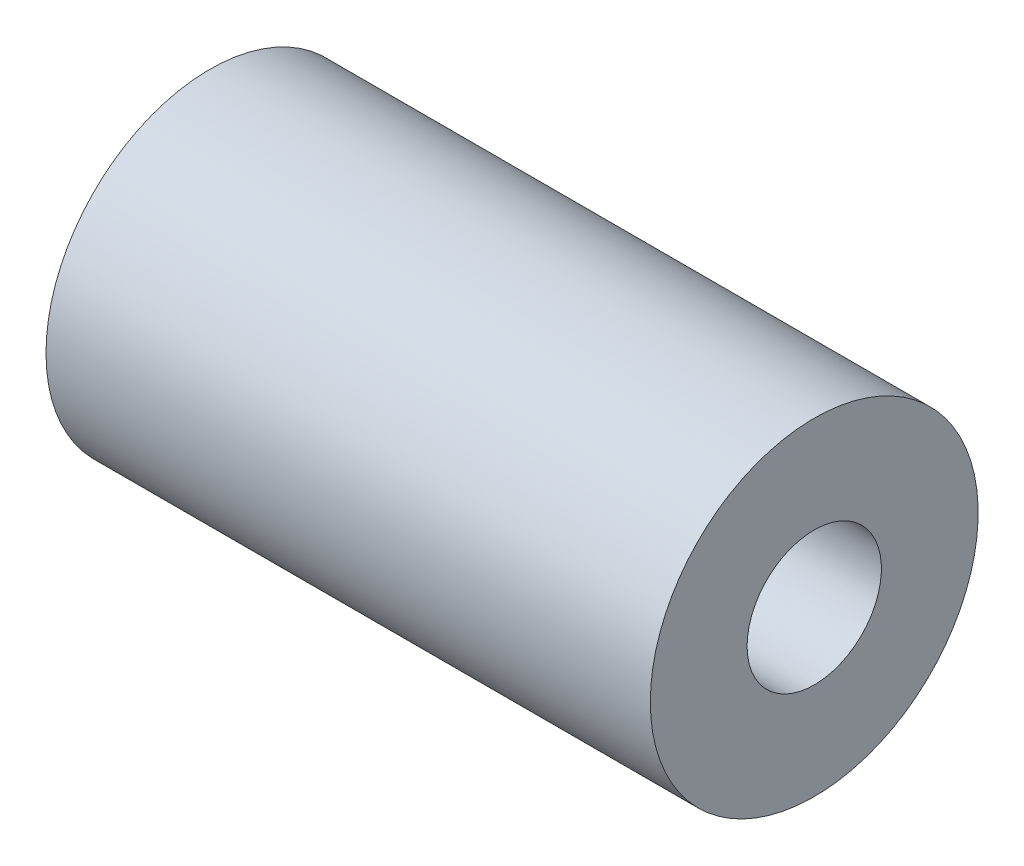
ISO-10303-21;
HEADER;
FILE_DESCRIPTION(('STEP AP214'),'2;1');
FILE_NAME('part.step','',(''),(''),'','','');
FILE_SCHEMA(('AUTOMOTIVE_DESIGN { 1 0 10303 214 1 1 1 1 }'));
ENDSEC;
DATA;
#1=APPLICATION_CONTEXT('core data for automotive mechanical design processes');
#2=APPLICATION_PROTOCOL_DEFINITION('international standard','automotive_design',2000,#1);
#3=PRODUCT_CONTEXT('',#1,'mechanical');
#4=PRODUCT('Part','Part','',(#3));
#5=PRODUCT_RELATED_PRODUCT_CATEGORY('part','',(#4));
#6=PRODUCT_DEFINITION_FORMATION('','',#4);
#7=PRODUCT_DEFINITION_CONTEXT('part definition',#1,'design');
#8=PRODUCT_DEFINITION('design','',#6,#7);
#9=PRODUCT_DEFINITION_SHAPE('','',#8);
#10=(LENGTH_UNIT() NAMED_UNIT(*) SI_UNIT(.MILLI.,.METRE.));
#11=(NAMED_UNIT(*) PLANE_ANGLE_UNIT() SI_UNIT($,.RADIAN.));
#12=(NAMED_UNIT(*) SI_UNIT($,.STERADIAN.) SOLID_ANGLE_UNIT());
#13=UNCERTAINTY_MEASURE_WITH_UNIT(LENGTH_MEASURE(1.E-05),#10,'distance_accuracy_value','');
#14=(GEOMETRIC_REPRESENTATION_CONTEXT(3) GLOBAL_UNCERTAINTY_ASSIGNED_CONTEXT((#13)) GLOBAL_UNIT_ASSIGNED_CONTEXT((#10,
#11,#12)) REPRESENTATION_CONTEXT('',''));
#15=CARTESIAN_POINT('',(0.,0.,0.));
#16=DIRECTION('',(0.,0.,1.));
#17=DIRECTION('',(1.,0.,0.));
#18=AXIS2_PLACEMENT_3D('',#15,#16,#17);
#19=CARTESIAN_POINT('',(0.,-6.35,0.));
#20=DIRECTION('',(-1.,0.,0.));
#21=DIRECTION('',(0.,0.,1.));
#22=AXIS2_PLACEMENT_3D('',#19,#20,#21);
#23=PLANE('',#22);
#24=CARTESIAN_POINT('',(0.,0.,0.));
#25=DIRECTION('',(-1.,0.,0.));
#26=DIRECTION('',(0.,0.,1.));
#27=AXIS2_PLACEMENT_3D('',#24,#25,#26);
#28=CIRCLE('',#27,15.5);
#29=CARTESIAN_POINT('',(0.,0.,15.5));
#30=VERTEX_POINT('',#29);
#31=EDGE_CURVE('E10',#30,#30,#28,.T.);
#32=ORIENTED_EDGE('',*,*,#31,.T.);
#33=EDGE_LOOP('',(#32));
#34=FACE_BOUND('',#33,.T.);
#35=CARTESIAN_POINT('',(0.,0.,0.));
#36=DIRECTION('',(-1.,0.,0.));
#37=DIRECTION('',(0.,0.,1.));
#38=AXIS2_PLACEMENT_3D('',#35,#36,#37);
#39=CIRCLE('',#38,6.35);
#40=CARTESIAN_POINT('',(0.,0.,6.35));
#41=VERTEX_POINT('',#40);
#42=EDGE_CURVE('E45',#41,#41,#39,.T.);
#43=ORIENTED_EDGE('',*,*,#42,.F.);
#44=EDGE_LOOP('',(#43));
#45=FACE_BOUND('',#44,.T.);
#46=ADVANCED_FACE('F31',(#34,#45),#23,.T.);
#47=CARTESIAN_POINT('',(0.,0.,0.));
#48=DIRECTION('',(-1.,0.,0.));
#49=DIRECTION('',(0.,0.,1.));
#50=AXIS2_PLACEMENT_3D('',#47,#48,#49);
#51=CYLINDRICAL_SURFACE('',#50,15.5);
#52=CARTESIAN_POINT('',(57.15,0.,0.));
#53=DIRECTION('',(-1.,0.,0.));
#54=DIRECTION('',(0.,0.,1.));
#55=AXIS2_PLACEMENT_3D('',#52,#53,#54);
#56=CIRCLE('',#55,15.5);
#57=CARTESIAN_POINT('',(57.15,0.,15.5));
#58=VERTEX_POINT('',#57);
#59=EDGE_CURVE('E37',#58,#58,#56,.T.);
#60=ORIENTED_EDGE('',*,*,#59,.T.);
#61=EDGE_LOOP('',(#60));
#62=FACE_BOUND('',#61,.T.);
#63=ORIENTED_EDGE('',*,*,#31,.F.);
#64=EDGE_LOOP('',(#63));
#65=FACE_BOUND('',#64,.T.);
#66=ADVANCED_FACE('F55',(#62,#65),#51,.T.);
#67=CARTESIAN_POINT('',(57.15,-6.35,0.));
#68=DIRECTION('',(1.,0.,0.));
#69=DIRECTION('',(0.,0.,-1.));
#70=AXIS2_PLACEMENT_3D('',#67,#68,#69);
#71=PLANE('',#70);
#72=CARTESIAN_POINT('',(57.15,0.,0.));
#73=DIRECTION('',(-1.,0.,0.));
#74=DIRECTION('',(0.,0.,1.));
#75=AXIS2_PLACEMENT_3D('',#72,#73,#74);
#76=CIRCLE('',#75,6.35);
#77=CARTESIAN_POINT('',(57.15,0.,6.35));
#78=VERTEX_POINT('',#77);
#79=EDGE_CURVE('E41',#78,#78,#76,.T.);
#80=ORIENTED_EDGE('',*,*,#79,.T.);
#81=EDGE_LOOP('',(#80));
#82=FACE_BOUND('',#81,.T.);
#83=ORIENTED_EDGE('',*,*,#59,.F.);
#84=EDGE_LOOP('',(#83));
#85=FACE_BOUND('',#84,.T.);
#86=ADVANCED_FACE('F59',(#82,#85),#71,.T.);
#87=CARTESIAN_POINT('',(0.,0.,0.));
#88=DIRECTION('',(-1.,0.,0.));
#89=DIRECTION('',(0.,0.,1.));
#90=AXIS2_PLACEMENT_3D('',#87,#88,#89);
#91=CYLINDRICAL_SURFACE('',#90,6.35);
#92=ORIENTED_EDGE('',*,*,#42,.T.);
#93=EDGE_LOOP('',(#92));
#94=FACE_BOUND('',#93,.T.);
#95=ORIENTED_EDGE('',*,*,#79,.F.);
#96=EDGE_LOOP('',(#95));
#97=FACE_BOUND('',#96,.T.);
#98=ADVANCED_FACE('F51',(#94,#97),#91,.F.);
#99=CLOSED_SHELL('',(#46,#66,#86,#98));
#100=MANIFOLD_SOLID_BREP('B2',#99);
#101=ADVANCED_BREP_SHAPE_REPRESENTATION('',(#18,#100),#14);
#102=SHAPE_DEFINITION_REPRESENTATION(#9,#101);
ENDSEC;
END-ISO-10303-21;
